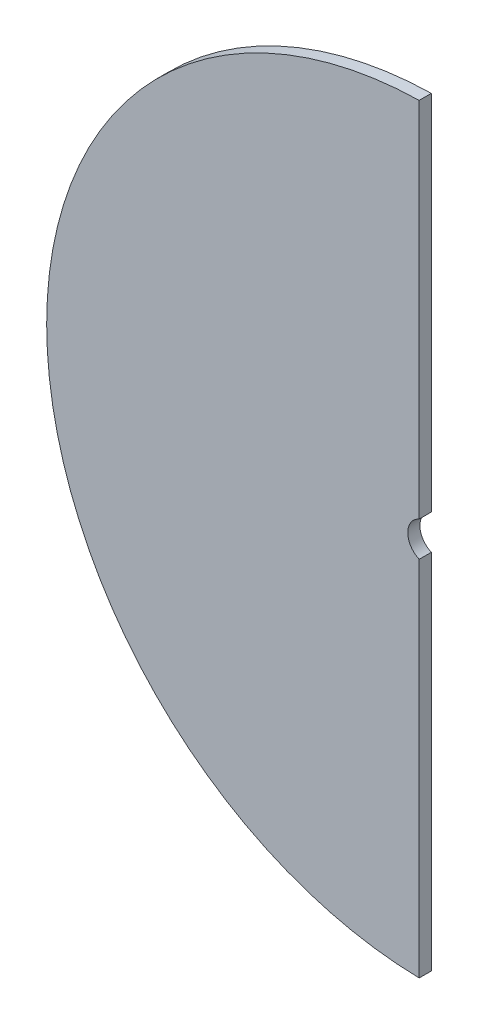
ISO-10303-21;
HEADER;
FILE_DESCRIPTION(('STEP AP214'),'2;1');
FILE_NAME('part.step','',(''),(''),'','','');
FILE_SCHEMA(('AUTOMOTIVE_DESIGN { 1 0 10303 214 1 1 1 1 }'));
ENDSEC;
DATA;
#1=APPLICATION_CONTEXT('core data for automotive mechanical design processes');
#2=APPLICATION_PROTOCOL_DEFINITION('international standard','automotive_design',2000,#1);
#3=PRODUCT_CONTEXT('',#1,'mechanical');
#4=PRODUCT('Part','Part','',(#3));
#5=PRODUCT_RELATED_PRODUCT_CATEGORY('part','',(#4));
#6=PRODUCT_DEFINITION_FORMATION('','',#4);
#7=PRODUCT_DEFINITION_CONTEXT('part definition',#1,'design');
#8=PRODUCT_DEFINITION('design','',#6,#7);
#9=PRODUCT_DEFINITION_SHAPE('','',#8);
#10=(LENGTH_UNIT() NAMED_UNIT(*) SI_UNIT(.MILLI.,.METRE.));
#11=(NAMED_UNIT(*) PLANE_ANGLE_UNIT() SI_UNIT($,.RADIAN.));
#12=(NAMED_UNIT(*) SI_UNIT($,.STERADIAN.) SOLID_ANGLE_UNIT());
#13=UNCERTAINTY_MEASURE_WITH_UNIT(LENGTH_MEASURE(1.E-05),#10,'distance_accuracy_value','');
#14=(GEOMETRIC_REPRESENTATION_CONTEXT(3) GLOBAL_UNCERTAINTY_ASSIGNED_CONTEXT((#13)) GLOBAL_UNIT_ASSIGNED_CONTEXT((#10,
#11,#12)) REPRESENTATION_CONTEXT('',''));
#15=CARTESIAN_POINT('',(0.,0.,0.));
#16=DIRECTION('',(0.,0.,1.));
#17=DIRECTION('',(1.,0.,0.));
#18=AXIS2_PLACEMENT_3D('',#15,#16,#17);
#19=CARTESIAN_POINT('',(0.,0.,1.6));
#20=DIRECTION('',(0.,0.,-1.));
#21=DIRECTION('',(-1.,0.,0.));
#22=AXIS2_PLACEMENT_3D('',#19,#20,#21);
#23=CYLINDRICAL_SURFACE('',#22,50.);
#24=CARTESIAN_POINT('',(0.,0.,1.6));
#25=DIRECTION('',(0.,0.,1.));
#26=DIRECTION('',(1.,0.,0.));
#27=AXIS2_PLACEMENT_3D('',#24,#25,#26);
#28=CIRCLE('',#27,50.);
#29=CARTESIAN_POINT('',(-0.999999999999987,49.9899989998,1.6));
#30=VERTEX_POINT('',#29);
#31=CARTESIAN_POINT('',(-0.999999999999987,-49.9899989998,1.6));
#32=VERTEX_POINT('',#31);
#33=EDGE_CURVE('E94',#30,#32,#28,.T.);
#34=ORIENTED_EDGE('',*,*,#33,.F.);
#35=DIRECTION('',(0.,0.,1.));
#36=VECTOR('',#35,1.);
#37=CARTESIAN_POINT('',(-0.999999999999987,49.9899989998,0.));
#38=LINE('',#37,#36);
#39=CARTESIAN_POINT('',(-0.999999999999987,49.9899989998,0.));
#40=VERTEX_POINT('',#39);
#41=EDGE_CURVE('E80',#40,#30,#38,.T.);
#42=ORIENTED_EDGE('',*,*,#41,.F.);
#43=CARTESIAN_POINT('',(0.,0.,0.));
#44=DIRECTION('',(0.,0.,1.));
#45=DIRECTION('',(1.,0.,0.));
#46=AXIS2_PLACEMENT_3D('',#43,#44,#45);
#47=CIRCLE('',#46,50.);
#48=CARTESIAN_POINT('',(-0.999999999999987,-49.9899989998,0.));
#49=VERTEX_POINT('',#48);
#50=EDGE_CURVE('E92',#40,#49,#47,.T.);
#51=ORIENTED_EDGE('',*,*,#50,.T.);
#52=DIRECTION('',(0.,0.,1.));
#53=VECTOR('',#52,1.);
#54=CARTESIAN_POINT('',(-0.999999999999987,-49.9899989998,0.));
#55=LINE('',#54,#53);
#56=EDGE_CURVE('E63',#49,#32,#55,.T.);
#57=ORIENTED_EDGE('',*,*,#56,.T.);
#58=EDGE_LOOP('',(#34,#42,#51,#57));
#59=FACE_BOUND('',#58,.T.);
#60=ADVANCED_FACE('F40',(#59),#23,.T.);
#61=CARTESIAN_POINT('',(0.,0.,1.6));
#62=DIRECTION('',(0.,0.,-1.));
#63=DIRECTION('',(-1.,0.,0.));
#64=AXIS2_PLACEMENT_3D('',#61,#62,#63);
#65=CYLINDRICAL_SURFACE('',#64,2.5);
#66=CARTESIAN_POINT('',(0.,0.,0.));
#67=DIRECTION('',(0.,0.,-1.));
#68=DIRECTION('',(1.,0.,0.));
#69=AXIS2_PLACEMENT_3D('',#66,#67,#68);
#70=CIRCLE('',#69,2.5);
#71=CARTESIAN_POINT('',(-0.999999999999987,-2.29128784747792,0.));
#72=VERTEX_POINT('',#71);
#73=CARTESIAN_POINT('',(-0.999999999999987,2.29128784747793,0.));
#74=VERTEX_POINT('',#73);
#75=EDGE_CURVE('E99',#72,#74,#70,.T.);
#76=ORIENTED_EDGE('',*,*,#75,.T.);
#77=DIRECTION('',(0.,0.,-1.));
#78=VECTOR('',#77,1.);
#79=CARTESIAN_POINT('',(-0.999999999999987,2.29128784747793,1.6));
#80=LINE('',#79,#78);
#81=CARTESIAN_POINT('',(-0.999999999999987,2.29128784747792,1.6));
#82=VERTEX_POINT('',#81);
#83=EDGE_CURVE('E55',#74,#82,#80,.F.);
#84=ORIENTED_EDGE('',*,*,#83,.T.);
#85=CARTESIAN_POINT('',(0.,0.,1.6));
#86=DIRECTION('',(0.,0.,-1.));
#87=DIRECTION('',(1.,0.,0.));
#88=AXIS2_PLACEMENT_3D('',#85,#86,#87);
#89=CIRCLE('',#88,2.5);
#90=CARTESIAN_POINT('',(-0.999999999999987,-2.29128784747792,1.6));
#91=VERTEX_POINT('',#90);
#92=EDGE_CURVE('E48',#91,#82,#89,.T.);
#93=ORIENTED_EDGE('',*,*,#92,.F.);
#94=DIRECTION('',(0.,0.,-1.));
#95=VECTOR('',#94,1.);
#96=CARTESIAN_POINT('',(-0.999999999999987,-2.29128784747793,1.6));
#97=LINE('',#96,#95);
#98=EDGE_CURVE('E103',#91,#72,#97,.T.);
#99=ORIENTED_EDGE('',*,*,#98,.T.);
#100=EDGE_LOOP('',(#76,#84,#93,#99));
#101=FACE_BOUND('',#100,.T.);
#102=ADVANCED_FACE('F125',(#101),#65,.F.);
#103=CARTESIAN_POINT('',(0.,0.,1.6));
#104=DIRECTION('',(0.,0.,1.));
#105=DIRECTION('',(1.,0.,0.));
#106=AXIS2_PLACEMENT_3D('',#103,#104,#105);
#107=PLANE('',#106);
#108=DIRECTION('',(0.,-1.,0.));
#109=VECTOR('',#108,1.);
#110=CARTESIAN_POINT('',(-0.999999999999987,49.9899989998,1.6));
#111=LINE('',#110,#109);
#112=EDGE_CURVE('E87',#30,#82,#111,.T.);
#113=ORIENTED_EDGE('',*,*,#112,.F.);
#114=ORIENTED_EDGE('',*,*,#33,.T.);
#115=EDGE_CURVE('E117',#91,#32,#111,.T.);
#116=ORIENTED_EDGE('',*,*,#115,.F.);
#117=ORIENTED_EDGE('',*,*,#92,.T.);
#118=EDGE_LOOP('',(#113,#114,#116,#117));
#119=FACE_BOUND('',#118,.T.);
#120=ADVANCED_FACE('F123',(#119),#107,.T.);
#121=CARTESIAN_POINT('',(0.,0.,0.));
#122=DIRECTION('',(0.,0.,1.));
#123=DIRECTION('',(1.,0.,0.));
#124=AXIS2_PLACEMENT_3D('',#121,#122,#123);
#125=PLANE('',#124);
#126=ORIENTED_EDGE('',*,*,#50,.F.);
#127=DIRECTION('',(0.,-1.,0.));
#128=VECTOR('',#127,1.);
#129=CARTESIAN_POINT('',(-0.999999999999987,49.9899989998,0.));
#130=LINE('',#129,#128);
#131=EDGE_CURVE('E77',#40,#74,#130,.T.);
#132=ORIENTED_EDGE('',*,*,#131,.T.);
#133=ORIENTED_EDGE('',*,*,#75,.F.);
#134=DIRECTION('',(0.,-1.,0.));
#135=VECTOR('',#134,1.);
#136=CARTESIAN_POINT('',(-0.999999999999987,0.,0.));
#137=LINE('',#136,#135);
#138=EDGE_CURVE('E11',#72,#49,#137,.T.);
#139=ORIENTED_EDGE('',*,*,#138,.T.);
#140=EDGE_LOOP('',(#126,#132,#133,#139));
#141=FACE_BOUND('',#140,.T.);
#142=ADVANCED_FACE('F97',(#141),#125,.F.);
#143=CARTESIAN_POINT('',(-0.999999999999987,49.9899989998,0.));
#144=DIRECTION('',(-1.,0.,0.));
#145=DIRECTION('',(0.,0.,1.));
#146=AXIS2_PLACEMENT_3D('',#143,#144,#145);
#147=PLANE('',#146);
#148=ORIENTED_EDGE('',*,*,#115,.T.);
#149=ORIENTED_EDGE('',*,*,#56,.F.);
#150=ORIENTED_EDGE('',*,*,#138,.F.);
#151=ORIENTED_EDGE('',*,*,#98,.F.);
#152=EDGE_LOOP('',(#148,#149,#150,#151));
#153=FACE_BOUND('',#152,.T.);
#154=ADVANCED_FACE('F120',(#153),#147,.F.);
#155=ORIENTED_EDGE('',*,*,#131,.F.);
#156=ORIENTED_EDGE('',*,*,#41,.T.);
#157=ORIENTED_EDGE('',*,*,#112,.T.);
#158=ORIENTED_EDGE('',*,*,#83,.F.);
#159=EDGE_LOOP('',(#155,#156,#157,#158));
#160=FACE_BOUND('',#159,.T.);
#161=ADVANCED_FACE('F79',(#160),#147,.F.);
#162=CLOSED_SHELL('',(#60,#102,#120,#142,#154,#161));
#163=MANIFOLD_SOLID_BREP('B2',#162);
#164=ADVANCED_BREP_SHAPE_REPRESENTATION('',(#18,#163),#14);
#165=SHAPE_DEFINITION_REPRESENTATION(#9,#164);
ENDSEC;
END-ISO-10303-21;
